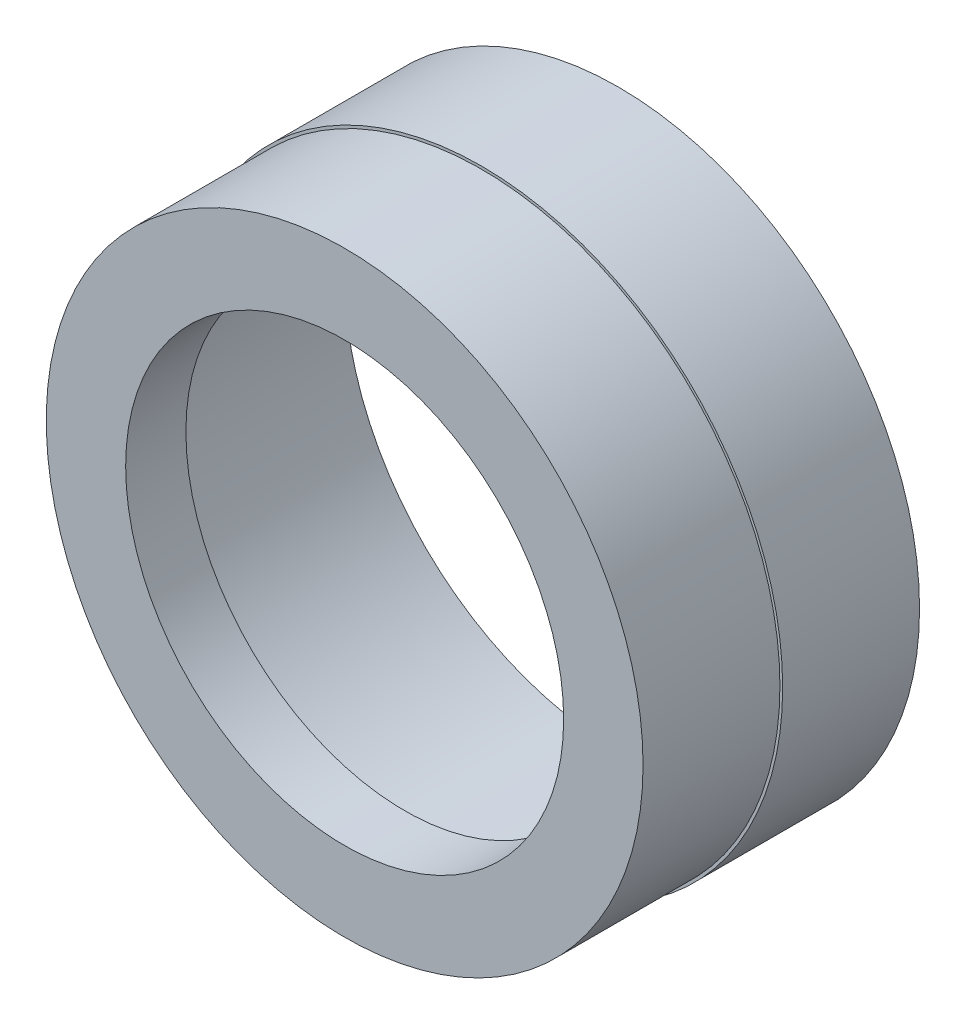
ISO-10303-21;
HEADER;
FILE_DESCRIPTION(('STEP AP214'),'2;1');
FILE_NAME('part.step','',(''),(''),'','','');
FILE_SCHEMA(('AUTOMOTIVE_DESIGN { 1 0 10303 214 1 1 1 1 }'));
ENDSEC;
DATA;
#1=APPLICATION_CONTEXT('core data for automotive mechanical design processes');
#2=APPLICATION_PROTOCOL_DEFINITION('international standard','automotive_design',2000,#1);
#3=PRODUCT_CONTEXT('',#1,'mechanical');
#4=PRODUCT('Part','Part','',(#3));
#5=PRODUCT_RELATED_PRODUCT_CATEGORY('part','',(#4));
#6=PRODUCT_DEFINITION_FORMATION('','',#4);
#7=PRODUCT_DEFINITION_CONTEXT('part definition',#1,'design');
#8=PRODUCT_DEFINITION('design','',#6,#7);
#9=PRODUCT_DEFINITION_SHAPE('','',#8);
#10=(LENGTH_UNIT() NAMED_UNIT(*) SI_UNIT(.MILLI.,.METRE.));
#11=(NAMED_UNIT(*) PLANE_ANGLE_UNIT() SI_UNIT($,.RADIAN.));
#12=(NAMED_UNIT(*) SI_UNIT($,.STERADIAN.) SOLID_ANGLE_UNIT());
#13=UNCERTAINTY_MEASURE_WITH_UNIT(LENGTH_MEASURE(1.E-05),#10,'distance_accuracy_value','');
#14=(GEOMETRIC_REPRESENTATION_CONTEXT(3) GLOBAL_UNCERTAINTY_ASSIGNED_CONTEXT((#13)) GLOBAL_UNIT_ASSIGNED_CONTEXT((#10,
#11,#12)) REPRESENTATION_CONTEXT('',''));
#15=CARTESIAN_POINT('',(0.,0.,0.));
#16=DIRECTION('',(0.,0.,1.));
#17=DIRECTION('',(1.,0.,0.));
#18=AXIS2_PLACEMENT_3D('',#15,#16,#17);
#19=CARTESIAN_POINT('',(0.,0.,-5.));
#20=DIRECTION('',(0.,0.,1.));
#21=DIRECTION('',(1.,0.,0.));
#22=AXIS2_PLACEMENT_3D('',#19,#20,#21);
#23=CYLINDRICAL_SURFACE('',#22,5.5);
#24=CARTESIAN_POINT('',(0.,0.,-5.));
#25=DIRECTION('',(0.,0.,1.));
#26=DIRECTION('',(1.,0.,0.));
#27=AXIS2_PLACEMENT_3D('',#24,#25,#26);
#28=CIRCLE('',#27,5.5);
#29=CARTESIAN_POINT('',(5.5,0.,-5.));
#30=VERTEX_POINT('',#29);
#31=EDGE_CURVE('E11',#30,#30,#28,.T.);
#32=ORIENTED_EDGE('',*,*,#31,.T.);
#33=EDGE_LOOP('',(#32));
#34=FACE_BOUND('',#33,.T.);
#35=CARTESIAN_POINT('',(0.,0.,-2.5));
#36=DIRECTION('',(0.,0.,1.));
#37=DIRECTION('',(1.,0.,0.));
#38=AXIS2_PLACEMENT_3D('',#35,#36,#37);
#39=CIRCLE('',#38,5.5);
#40=CARTESIAN_POINT('',(5.5,0.,-2.5));
#41=VERTEX_POINT('',#40);
#42=EDGE_CURVE('E35',#41,#41,#39,.F.);
#43=ORIENTED_EDGE('',*,*,#42,.T.);
#44=EDGE_LOOP('',(#43));
#45=FACE_BOUND('',#44,.T.);
#46=ADVANCED_FACE('F32',(#34,#45),#23,.T.);
#47=CARTESIAN_POINT('',(0.,0.,0.));
#48=DIRECTION('',(0.,0.,1.));
#49=DIRECTION('',(1.,0.,0.));
#50=AXIS2_PLACEMENT_3D('',#47,#48,#49);
#51=PLANE('',#50);
#52=CARTESIAN_POINT('',(0.,0.,0.));
#53=DIRECTION('',(0.,0.,1.));
#54=DIRECTION('',(1.,0.,0.));
#55=AXIS2_PLACEMENT_3D('',#52,#53,#54);
#56=CIRCLE('',#55,4.);
#57=CARTESIAN_POINT('',(4.,0.,0.));
#58=VERTEX_POINT('',#57);
#59=EDGE_CURVE('E47',#58,#58,#56,.T.);
#60=ORIENTED_EDGE('',*,*,#59,.F.);
#61=EDGE_LOOP('',(#60));
#62=FACE_BOUND('',#61,.T.);
#63=CARTESIAN_POINT('',(0.,0.,0.));
#64=DIRECTION('',(0.,0.,1.));
#65=DIRECTION('',(1.,0.,0.));
#66=AXIS2_PLACEMENT_3D('',#63,#64,#65);
#67=CIRCLE('',#66,5.45);
#68=CARTESIAN_POINT('',(5.45,0.,0.));
#69=VERTEX_POINT('',#68);
#70=EDGE_CURVE('E54',#69,#69,#67,.T.);
#71=ORIENTED_EDGE('',*,*,#70,.T.);
#72=EDGE_LOOP('',(#71));
#73=FACE_BOUND('',#72,.T.);
#74=ADVANCED_FACE('F80',(#62,#73),#51,.T.);
#75=CARTESIAN_POINT('',(0.,0.,-5.));
#76=DIRECTION('',(0.,0.,1.));
#77=DIRECTION('',(1.,0.,0.));
#78=AXIS2_PLACEMENT_3D('',#75,#76,#77);
#79=PLANE('',#78);
#80=CARTESIAN_POINT('',(0.,0.,-5.));
#81=DIRECTION('',(0.,0.,-1.));
#82=DIRECTION('',(-1.,0.,0.));
#83=AXIS2_PLACEMENT_3D('',#80,#81,#82);
#84=CIRCLE('',#83,5.);
#85=CARTESIAN_POINT('',(-5.,0.,-5.));
#86=VERTEX_POINT('',#85);
#87=EDGE_CURVE('E43',#86,#86,#84,.T.);
#88=ORIENTED_EDGE('',*,*,#87,.F.);
#89=EDGE_LOOP('',(#88));
#90=FACE_BOUND('',#89,.T.);
#91=ORIENTED_EDGE('',*,*,#31,.F.);
#92=EDGE_LOOP('',(#91));
#93=FACE_BOUND('',#92,.T.);
#94=ADVANCED_FACE('F84',(#90,#93),#79,.F.);
#95=CARTESIAN_POINT('',(0.,0.,-1.1));
#96=DIRECTION('',(0.,0.,-1.));
#97=DIRECTION('',(-1.,0.,0.));
#98=AXIS2_PLACEMENT_3D('',#95,#96,#97);
#99=CYLINDRICAL_SURFACE('',#98,5.);
#100=CARTESIAN_POINT('',(0.,0.,-1.1));
#101=DIRECTION('',(0.,0.,-1.));
#102=DIRECTION('',(-1.,0.,0.));
#103=AXIS2_PLACEMENT_3D('',#100,#101,#102);
#104=CIRCLE('',#103,5.);
#105=CARTESIAN_POINT('',(-5.,0.,-1.1));
#106=VERTEX_POINT('',#105);
#107=EDGE_CURVE('E39',#106,#106,#104,.T.);
#108=ORIENTED_EDGE('',*,*,#107,.F.);
#109=EDGE_LOOP('',(#108));
#110=FACE_BOUND('',#109,.T.);
#111=ORIENTED_EDGE('',*,*,#87,.T.);
#112=EDGE_LOOP('',(#111));
#113=FACE_BOUND('',#112,.T.);
#114=ADVANCED_FACE('F89',(#110,#113),#99,.F.);
#115=CARTESIAN_POINT('',(0.,0.,-1.1));
#116=DIRECTION('',(0.,0.,-1.));
#117=DIRECTION('',(-1.,0.,0.));
#118=AXIS2_PLACEMENT_3D('',#115,#116,#117);
#119=PLANE('',#118);
#120=CARTESIAN_POINT('',(0.,0.,-1.1));
#121=DIRECTION('',(0.,0.,-1.));
#122=DIRECTION('',(-1.,0.,0.));
#123=AXIS2_PLACEMENT_3D('',#120,#121,#122);
#124=CIRCLE('',#123,4.);
#125=CARTESIAN_POINT('',(-4.,0.,-1.1));
#126=VERTEX_POINT('',#125);
#127=EDGE_CURVE('E49',#126,#126,#124,.F.);
#128=ORIENTED_EDGE('',*,*,#127,.T.);
#129=EDGE_LOOP('',(#128));
#130=FACE_BOUND('',#129,.T.);
#131=ORIENTED_EDGE('',*,*,#107,.T.);
#132=EDGE_LOOP('',(#131));
#133=FACE_BOUND('',#132,.T.);
#134=ADVANCED_FACE('F76',(#130,#133),#119,.T.);
#135=CARTESIAN_POINT('',(0.,0.,-5.001));
#136=DIRECTION('',(0.,0.,1.));
#137=DIRECTION('',(1.,0.,0.));
#138=AXIS2_PLACEMENT_3D('',#135,#136,#137);
#139=CYLINDRICAL_SURFACE('',#138,4.);
#140=ORIENTED_EDGE('',*,*,#127,.F.);
#141=EDGE_LOOP('',(#140));
#142=FACE_BOUND('',#141,.T.);
#143=ORIENTED_EDGE('',*,*,#59,.T.);
#144=EDGE_LOOP('',(#143));
#145=FACE_BOUND('',#144,.T.);
#146=ADVANCED_FACE('F69',(#142,#145),#139,.F.);
#147=CARTESIAN_POINT('',(0.,0.,-2.5));
#148=DIRECTION('',(0.,0.,1.));
#149=DIRECTION('',(1.,0.,0.));
#150=AXIS2_PLACEMENT_3D('',#147,#148,#149);
#151=PLANE('',#150);
#152=ORIENTED_EDGE('',*,*,#42,.F.);
#153=EDGE_LOOP('',(#152));
#154=FACE_BOUND('',#153,.T.);
#155=CARTESIAN_POINT('',(0.,0.,-2.5));
#156=DIRECTION('',(0.,0.,1.));
#157=DIRECTION('',(1.,0.,0.));
#158=AXIS2_PLACEMENT_3D('',#155,#156,#157);
#159=CIRCLE('',#158,5.45);
#160=CARTESIAN_POINT('',(5.45,0.,-2.5));
#161=VERTEX_POINT('',#160);
#162=EDGE_CURVE('E57',#161,#161,#159,.T.);
#163=ORIENTED_EDGE('',*,*,#162,.F.);
#164=EDGE_LOOP('',(#163));
#165=FACE_BOUND('',#164,.T.);
#166=ADVANCED_FACE('F65',(#154,#165),#151,.T.);
#167=CARTESIAN_POINT('',(0.,0.,-2.5));
#168=DIRECTION('',(0.,0.,1.));
#169=DIRECTION('',(1.,0.,0.));
#170=AXIS2_PLACEMENT_3D('',#167,#168,#169);
#171=CYLINDRICAL_SURFACE('',#170,5.45);
#172=ORIENTED_EDGE('',*,*,#162,.T.);
#173=EDGE_LOOP('',(#172));
#174=FACE_BOUND('',#173,.T.);
#175=ORIENTED_EDGE('',*,*,#70,.F.);
#176=EDGE_LOOP('',(#175));
#177=FACE_BOUND('',#176,.T.);
#178=ADVANCED_FACE('F68',(#174,#177),#171,.T.);
#179=CLOSED_SHELL('',(#46,#74,#94,#114,#134,#146,#166,#178));
#180=MANIFOLD_SOLID_BREP('B2',#179);
#181=ADVANCED_BREP_SHAPE_REPRESENTATION('',(#18,#180),#14);
#182=SHAPE_DEFINITION_REPRESENTATION(#9,#181);
ENDSEC;
END-ISO-10303-21;
